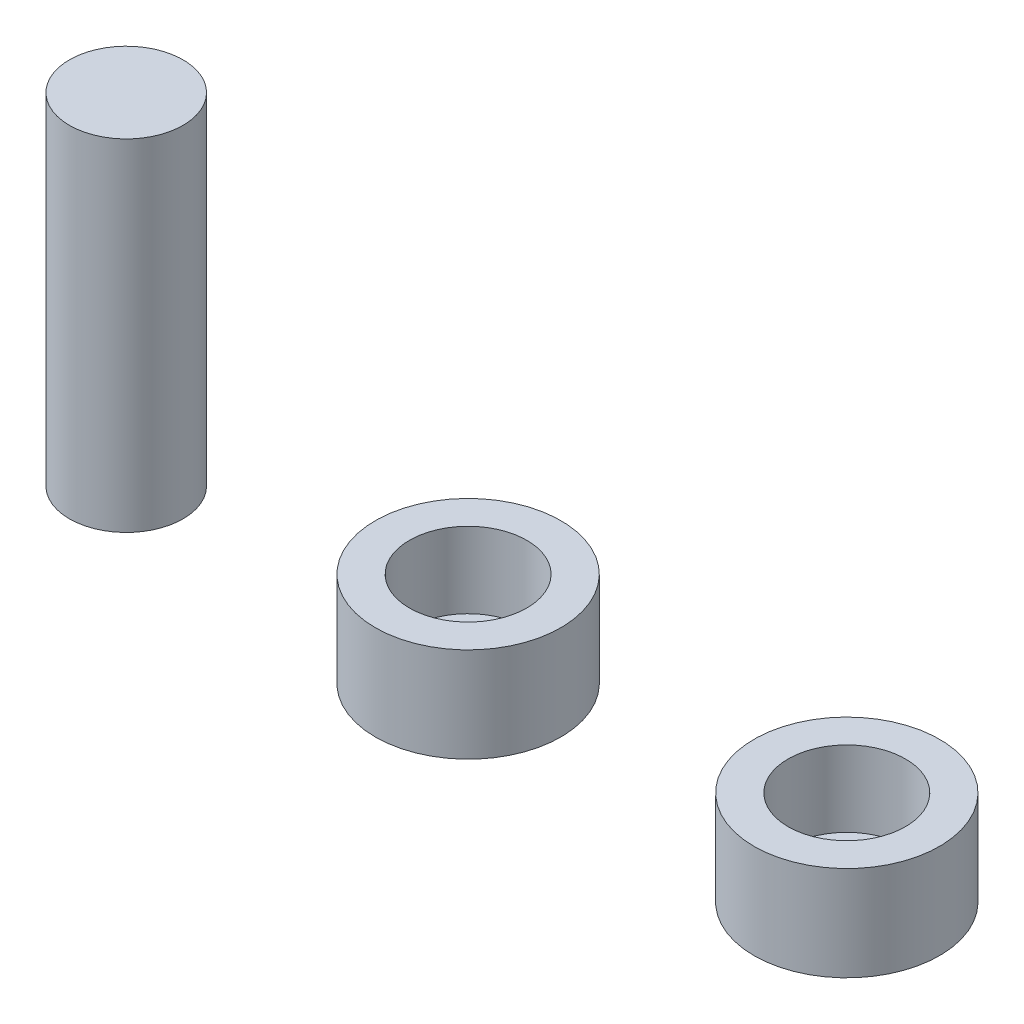
ISO-10303-21;
HEADER;
FILE_DESCRIPTION(('STEP AP214'),'2;1');
FILE_NAME('part.step','',(''),(''),'','','');
FILE_SCHEMA(('AUTOMOTIVE_DESIGN { 1 0 10303 214 1 1 1 1 }'));
ENDSEC;
DATA;
#1=APPLICATION_CONTEXT('core data for automotive mechanical design processes');
#2=APPLICATION_PROTOCOL_DEFINITION('international standard','automotive_design',2000,#1);
#3=PRODUCT_CONTEXT('',#1,'mechanical');
#4=PRODUCT('Part','Part','',(#3));
#5=PRODUCT_RELATED_PRODUCT_CATEGORY('part','',(#4));
#6=PRODUCT_DEFINITION_FORMATION('','',#4);
#7=PRODUCT_DEFINITION_CONTEXT('part definition',#1,'design');
#8=PRODUCT_DEFINITION('design','',#6,#7);
#9=PRODUCT_DEFINITION_SHAPE('','',#8);
#10=(LENGTH_UNIT() NAMED_UNIT(*) SI_UNIT(.MILLI.,.METRE.));
#11=(NAMED_UNIT(*) PLANE_ANGLE_UNIT() SI_UNIT($,.RADIAN.));
#12=(NAMED_UNIT(*) SI_UNIT($,.STERADIAN.) SOLID_ANGLE_UNIT());
#13=UNCERTAINTY_MEASURE_WITH_UNIT(LENGTH_MEASURE(1.E-05),#10,'distance_accuracy_value','');
#14=(GEOMETRIC_REPRESENTATION_CONTEXT(3) GLOBAL_UNCERTAINTY_ASSIGNED_CONTEXT((#13)) GLOBAL_UNIT_ASSIGNED_CONTEXT((#10,
#11,#12)) REPRESENTATION_CONTEXT('',''));
#15=CARTESIAN_POINT('',(0.,0.,0.));
#16=DIRECTION('',(0.,0.,1.));
#17=DIRECTION('',(1.,0.,0.));
#18=AXIS2_PLACEMENT_3D('',#15,#16,#17);
#19=CARTESIAN_POINT('',(10.,2.5,0.));
#20=DIRECTION('',(0.,-1.,0.));
#21=DIRECTION('',(0.,0.,-1.));
#22=AXIS2_PLACEMENT_3D('',#19,#20,#21);
#23=CYLINDRICAL_SURFACE('',#22,2.45);
#24=CARTESIAN_POINT('',(10.,2.5,0.));
#25=DIRECTION('',(0.,-1.,0.));
#26=DIRECTION('',(0.,0.,1.));
#27=AXIS2_PLACEMENT_3D('',#24,#25,#26);
#28=CIRCLE('',#27,2.45);
#29=CARTESIAN_POINT('',(10.,2.5,2.45));
#30=VERTEX_POINT('',#29);
#31=EDGE_CURVE('E11',#30,#30,#28,.T.);
#32=ORIENTED_EDGE('',*,*,#31,.T.);
#33=EDGE_LOOP('',(#32));
#34=FACE_BOUND('',#33,.T.);
#35=CARTESIAN_POINT('',(10.,0.,0.));
#36=DIRECTION('',(0.,-1.,0.));
#37=DIRECTION('',(0.,0.,1.));
#38=AXIS2_PLACEMENT_3D('',#35,#36,#37);
#39=CIRCLE('',#38,2.45);
#40=CARTESIAN_POINT('',(10.,0.,2.45));
#41=VERTEX_POINT('',#40);
#42=EDGE_CURVE('E42',#41,#41,#39,.T.);
#43=ORIENTED_EDGE('',*,*,#42,.F.);
#44=EDGE_LOOP('',(#43));
#45=FACE_BOUND('',#44,.T.);
#46=ADVANCED_FACE('F39',(#34,#45),#23,.T.);
#47=CARTESIAN_POINT('',(10.,2.5,0.));
#48=DIRECTION('',(0.,1.,0.));
#49=DIRECTION('',(0.,0.,1.));
#50=AXIS2_PLACEMENT_3D('',#47,#48,#49);
#51=PLANE('',#50);
#52=CARTESIAN_POINT('',(10.,2.5,0.));
#53=DIRECTION('',(0.,-1.,0.));
#54=DIRECTION('',(0.,0.,1.));
#55=AXIS2_PLACEMENT_3D('',#52,#53,#54);
#56=CIRCLE('',#55,1.55);
#57=CARTESIAN_POINT('',(10.,2.5,1.55));
#58=VERTEX_POINT('',#57);
#59=EDGE_CURVE('E51',#58,#58,#56,.T.);
#60=ORIENTED_EDGE('',*,*,#59,.T.);
#61=EDGE_LOOP('',(#60));
#62=FACE_BOUND('',#61,.T.);
#63=ORIENTED_EDGE('',*,*,#31,.F.);
#64=EDGE_LOOP('',(#63));
#65=FACE_BOUND('',#64,.T.);
#66=ADVANCED_FACE('F69',(#62,#65),#51,.T.);
#67=CARTESIAN_POINT('',(10.,0.,0.));
#68=DIRECTION('',(0.,1.,0.));
#69=DIRECTION('',(0.,0.,1.));
#70=AXIS2_PLACEMENT_3D('',#67,#68,#69);
#71=PLANE('',#70);
#72=ORIENTED_EDGE('',*,*,#42,.T.);
#73=EDGE_LOOP('',(#72));
#74=FACE_BOUND('',#73,.T.);
#75=ADVANCED_FACE('F66',(#74),#71,.F.);
#76=CARTESIAN_POINT('',(10.,0.5,0.));
#77=DIRECTION('',(0.,1.,0.));
#78=DIRECTION('',(0.,0.,1.));
#79=AXIS2_PLACEMENT_3D('',#76,#77,#78);
#80=CYLINDRICAL_SURFACE('',#79,1.55);
#81=CARTESIAN_POINT('',(10.,0.5,0.));
#82=DIRECTION('',(0.,-1.,0.));
#83=DIRECTION('',(0.,0.,1.));
#84=AXIS2_PLACEMENT_3D('',#81,#82,#83);
#85=CIRCLE('',#84,1.55);
#86=CARTESIAN_POINT('',(10.,0.5,1.55));
#87=VERTEX_POINT('',#86);
#88=EDGE_CURVE('E49',#87,#87,#85,.T.);
#89=ORIENTED_EDGE('',*,*,#88,.T.);
#90=EDGE_LOOP('',(#89));
#91=FACE_BOUND('',#90,.T.);
#92=ORIENTED_EDGE('',*,*,#59,.F.);
#93=EDGE_LOOP('',(#92));
#94=FACE_BOUND('',#93,.T.);
#95=ADVANCED_FACE('F57',(#91,#94),#80,.F.);
#96=CARTESIAN_POINT('',(10.,0.5,0.));
#97=DIRECTION('',(0.,1.,0.));
#98=DIRECTION('',(0.,0.,1.));
#99=AXIS2_PLACEMENT_3D('',#96,#97,#98);
#100=PLANE('',#99);
#101=ORIENTED_EDGE('',*,*,#88,.F.);
#102=EDGE_LOOP('',(#101));
#103=FACE_BOUND('',#102,.T.);
#104=ADVANCED_FACE('F60',(#103),#100,.T.);
#105=CLOSED_SHELL('',(#46,#66,#75,#95,#104));
#106=MANIFOLD_SOLID_BREP('B2',#105);
#107=CARTESIAN_POINT('',(-9.0272965862901,9.,0.));
#108=DIRECTION('',(0.,-1.,0.));
#109=DIRECTION('',(0.,0.,-1.));
#110=AXIS2_PLACEMENT_3D('',#107,#108,#109);
#111=CYLINDRICAL_SURFACE('',#110,1.5);
#112=CARTESIAN_POINT('',(-9.0272965862901,9.,0.));
#113=DIRECTION('',(0.,1.,0.));
#114=DIRECTION('',(0.,0.,1.));
#115=AXIS2_PLACEMENT_3D('',#112,#113,#114);
#116=CIRCLE('',#115,1.5);
#117=CARTESIAN_POINT('',(-9.0272965862901,9.,1.5));
#118=VERTEX_POINT('',#117);
#119=EDGE_CURVE('E38',#118,#118,#116,.T.);
#120=ORIENTED_EDGE('',*,*,#119,.F.);
#121=EDGE_LOOP('',(#120));
#122=FACE_BOUND('',#121,.T.);
#123=CARTESIAN_POINT('',(-9.0272965862901,0.,0.));
#124=DIRECTION('',(0.,1.,0.));
#125=DIRECTION('',(0.,0.,1.));
#126=AXIS2_PLACEMENT_3D('',#123,#124,#125);
#127=CIRCLE('',#126,1.5);
#128=CARTESIAN_POINT('',(-9.0272965862901,0.,1.5));
#129=VERTEX_POINT('',#128);
#130=EDGE_CURVE('E119',#129,#129,#127,.T.);
#131=ORIENTED_EDGE('',*,*,#130,.T.);
#132=EDGE_LOOP('',(#131));
#133=FACE_BOUND('',#132,.T.);
#134=ADVANCED_FACE('F116',(#122,#133),#111,.T.);
#135=CARTESIAN_POINT('',(-9.0272965862901,9.,0.));
#136=DIRECTION('',(0.,1.,0.));
#137=DIRECTION('',(0.,0.,1.));
#138=AXIS2_PLACEMENT_3D('',#135,#136,#137);
#139=PLANE('',#138);
#140=ORIENTED_EDGE('',*,*,#119,.T.);
#141=EDGE_LOOP('',(#140));
#142=FACE_BOUND('',#141,.T.);
#143=ADVANCED_FACE('F131',(#142),#139,.T.);
#144=CARTESIAN_POINT('',(-9.0272965862901,0.,0.));
#145=DIRECTION('',(0.,1.,0.));
#146=DIRECTION('',(0.,0.,1.));
#147=AXIS2_PLACEMENT_3D('',#144,#145,#146);
#148=PLANE('',#147);
#149=ORIENTED_EDGE('',*,*,#130,.F.);
#150=EDGE_LOOP('',(#149));
#151=FACE_BOUND('',#150,.T.);
#152=ADVANCED_FACE('F129',(#151),#148,.F.);
#153=CLOSED_SHELL('',(#134,#143,#152));
#154=MANIFOLD_SOLID_BREP('B6',#153);
#155=CARTESIAN_POINT('',(0.,2.5,0.));
#156=DIRECTION('',(0.,-1.,0.));
#157=DIRECTION('',(0.,0.,-1.));
#158=AXIS2_PLACEMENT_3D('',#155,#156,#157);
#159=CYLINDRICAL_SURFACE('',#158,2.45);
#160=CARTESIAN_POINT('',(0.,2.5,0.));
#161=DIRECTION('',(0.,1.,0.));
#162=DIRECTION('',(0.,0.,1.));
#163=AXIS2_PLACEMENT_3D('',#160,#161,#162);
#164=CIRCLE('',#163,2.45);
#165=CARTESIAN_POINT('',(0.,2.5,2.45));
#166=VERTEX_POINT('',#165);
#167=EDGE_CURVE('E115',#166,#166,#164,.T.);
#168=ORIENTED_EDGE('',*,*,#167,.F.);
#169=EDGE_LOOP('',(#168));
#170=FACE_BOUND('',#169,.T.);
#171=CARTESIAN_POINT('',(0.,0.,0.));
#172=DIRECTION('',(0.,1.,0.));
#173=DIRECTION('',(0.,0.,1.));
#174=AXIS2_PLACEMENT_3D('',#171,#172,#173);
#175=CIRCLE('',#174,2.45);
#176=CARTESIAN_POINT('',(0.,0.,2.45));
#177=VERTEX_POINT('',#176);
#178=EDGE_CURVE('E159',#177,#177,#175,.T.);
#179=ORIENTED_EDGE('',*,*,#178,.T.);
#180=EDGE_LOOP('',(#179));
#181=FACE_BOUND('',#180,.T.);
#182=ADVANCED_FACE('F156',(#170,#181),#159,.T.);
#183=CARTESIAN_POINT('',(0.,2.5,0.));
#184=DIRECTION('',(0.,1.,0.));
#185=DIRECTION('',(0.,0.,1.));
#186=AXIS2_PLACEMENT_3D('',#183,#184,#185);
#187=PLANE('',#186);
#188=CARTESIAN_POINT('',(0.,2.5,0.));
#189=DIRECTION('',(0.,1.,0.));
#190=DIRECTION('',(0.,0.,1.));
#191=AXIS2_PLACEMENT_3D('',#188,#189,#190);
#192=CIRCLE('',#191,1.55);
#193=CARTESIAN_POINT('',(0.,2.5,1.55));
#194=VERTEX_POINT('',#193);
#195=EDGE_CURVE('E168',#194,#194,#192,.T.);
#196=ORIENTED_EDGE('',*,*,#195,.F.);
#197=EDGE_LOOP('',(#196));
#198=FACE_BOUND('',#197,.T.);
#199=ORIENTED_EDGE('',*,*,#167,.T.);
#200=EDGE_LOOP('',(#199));
#201=FACE_BOUND('',#200,.T.);
#202=ADVANCED_FACE('F183',(#198,#201),#187,.T.);
#203=CARTESIAN_POINT('',(0.,0.,0.));
#204=DIRECTION('',(0.,1.,0.));
#205=DIRECTION('',(0.,0.,1.));
#206=AXIS2_PLACEMENT_3D('',#203,#204,#205);
#207=PLANE('',#206);
#208=ORIENTED_EDGE('',*,*,#178,.F.);
#209=EDGE_LOOP('',(#208));
#210=FACE_BOUND('',#209,.T.);
#211=ADVANCED_FACE('F179',(#210),#207,.F.);
#212=CARTESIAN_POINT('',(0.,0.5,0.));
#213=DIRECTION('',(0.,1.,0.));
#214=DIRECTION('',(0.,0.,1.));
#215=AXIS2_PLACEMENT_3D('',#212,#213,#214);
#216=CYLINDRICAL_SURFACE('',#215,1.55);
#217=CARTESIAN_POINT('',(0.,0.5,0.));
#218=DIRECTION('',(0.,1.,0.));
#219=DIRECTION('',(0.,0.,1.));
#220=AXIS2_PLACEMENT_3D('',#217,#218,#219);
#221=CIRCLE('',#220,1.55);
#222=CARTESIAN_POINT('',(0.,0.5,1.55));
#223=VERTEX_POINT('',#222);
#224=EDGE_CURVE('E166',#223,#223,#221,.T.);
#225=ORIENTED_EDGE('',*,*,#224,.F.);
#226=EDGE_LOOP('',(#225));
#227=FACE_BOUND('',#226,.T.);
#228=ORIENTED_EDGE('',*,*,#195,.T.);
#229=EDGE_LOOP('',(#228));
#230=FACE_BOUND('',#229,.T.);
#231=ADVANCED_FACE('F176',(#227,#230),#216,.F.);
#232=CARTESIAN_POINT('',(0.,0.5,0.));
#233=DIRECTION('',(0.,1.,0.));
#234=DIRECTION('',(0.,0.,1.));
#235=AXIS2_PLACEMENT_3D('',#232,#233,#234);
#236=PLANE('',#235);
#237=ORIENTED_EDGE('',*,*,#224,.T.);
#238=EDGE_LOOP('',(#237));
#239=FACE_BOUND('',#238,.T.);
#240=ADVANCED_FACE('F174',(#239),#236,.T.);
#241=CLOSED_SHELL('',(#182,#202,#211,#231,#240));
#242=MANIFOLD_SOLID_BREP('B33',#241);
#243=ADVANCED_BREP_SHAPE_REPRESENTATION('',(#18,#106,#154,#242),#14);
#244=SHAPE_DEFINITION_REPRESENTATION(#9,#243);
ENDSEC;
END-ISO-10303-21;
